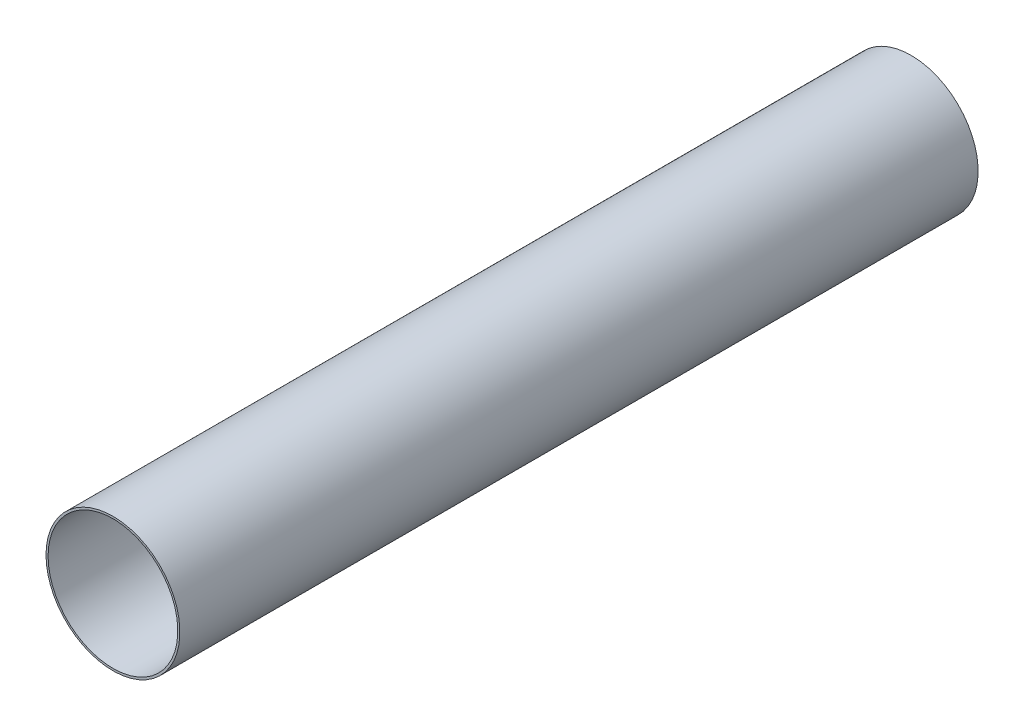
ISO-10303-21;
HEADER;
FILE_DESCRIPTION(('STEP AP214'),'2;1');
FILE_NAME('part.step','',(''),(''),'','','');
FILE_SCHEMA(('AUTOMOTIVE_DESIGN { 1 0 10303 214 1 1 1 1 }'));
ENDSEC;
DATA;
#1=APPLICATION_CONTEXT('core data for automotive mechanical design processes');
#2=APPLICATION_PROTOCOL_DEFINITION('international standard','automotive_design',2000,#1);
#3=PRODUCT_CONTEXT('',#1,'mechanical');
#4=PRODUCT('Part','Part','',(#3));
#5=PRODUCT_RELATED_PRODUCT_CATEGORY('part','',(#4));
#6=PRODUCT_DEFINITION_FORMATION('','',#4);
#7=PRODUCT_DEFINITION_CONTEXT('part definition',#1,'design');
#8=PRODUCT_DEFINITION('design','',#6,#7);
#9=PRODUCT_DEFINITION_SHAPE('','',#8);
#10=(LENGTH_UNIT() NAMED_UNIT(*) SI_UNIT(.MILLI.,.METRE.));
#11=(NAMED_UNIT(*) PLANE_ANGLE_UNIT() SI_UNIT($,.RADIAN.));
#12=(NAMED_UNIT(*) SI_UNIT($,.STERADIAN.) SOLID_ANGLE_UNIT());
#13=UNCERTAINTY_MEASURE_WITH_UNIT(LENGTH_MEASURE(1.E-05),#10,'distance_accuracy_value','');
#14=(GEOMETRIC_REPRESENTATION_CONTEXT(3) GLOBAL_UNCERTAINTY_ASSIGNED_CONTEXT((#13)) GLOBAL_UNIT_ASSIGNED_CONTEXT((#10,
#11,#12)) REPRESENTATION_CONTEXT('',''));
#15=CARTESIAN_POINT('',(0.,0.,0.));
#16=DIRECTION('',(0.,0.,1.));
#17=DIRECTION('',(1.,0.,0.));
#18=AXIS2_PLACEMENT_3D('',#15,#16,#17);
#19=CARTESIAN_POINT('',(0.,0.,609.6));
#20=DIRECTION('',(0.,0.,1.));
#21=DIRECTION('',(1.,0.,0.));
#22=AXIS2_PLACEMENT_3D('',#19,#20,#21);
#23=PLANE('',#22);
#24=CARTESIAN_POINT('',(0.,0.,609.6));
#25=DIRECTION('',(0.,0.,1.));
#26=DIRECTION('',(1.,0.,0.));
#27=AXIS2_PLACEMENT_3D('',#24,#25,#26);
#28=CIRCLE('',#27,51.1175);
#29=CARTESIAN_POINT('',(-51.1175,0.,609.6));
#30=VERTEX_POINT('',#29);
#31=EDGE_CURVE('E10',#30,#30,#28,.T.);
#32=ORIENTED_EDGE('',*,*,#31,.T.);
#33=EDGE_LOOP('',(#32));
#34=FACE_BOUND('',#33,.T.);
#35=CARTESIAN_POINT('',(0.,0.,609.6));
#36=DIRECTION('',(0.,0.,1.));
#37=DIRECTION('',(1.,0.,0.));
#38=AXIS2_PLACEMENT_3D('',#35,#36,#37);
#39=CIRCLE('',#38,49.53);
#40=CARTESIAN_POINT('',(-49.53,0.,609.6));
#41=VERTEX_POINT('',#40);
#42=EDGE_CURVE('E41',#41,#41,#39,.T.);
#43=ORIENTED_EDGE('',*,*,#42,.F.);
#44=EDGE_LOOP('',(#43));
#45=FACE_BOUND('',#44,.T.);
#46=ADVANCED_FACE('F30',(#34,#45),#23,.T.);
#47=CARTESIAN_POINT('',(0.,0.,0.));
#48=DIRECTION('',(0.,0.,1.));
#49=DIRECTION('',(1.,0.,0.));
#50=AXIS2_PLACEMENT_3D('',#47,#48,#49);
#51=PLANE('',#50);
#52=CARTESIAN_POINT('',(0.,0.,0.));
#53=DIRECTION('',(0.,0.,1.));
#54=DIRECTION('',(1.,0.,0.));
#55=AXIS2_PLACEMENT_3D('',#52,#53,#54);
#56=CIRCLE('',#55,51.1175);
#57=CARTESIAN_POINT('',(-51.1175,0.,0.));
#58=VERTEX_POINT('',#57);
#59=EDGE_CURVE('E34',#58,#58,#56,.T.);
#60=ORIENTED_EDGE('',*,*,#59,.F.);
#61=EDGE_LOOP('',(#60));
#62=FACE_BOUND('',#61,.T.);
#63=CARTESIAN_POINT('',(0.,0.,0.));
#64=DIRECTION('',(0.,0.,1.));
#65=DIRECTION('',(1.,0.,0.));
#66=AXIS2_PLACEMENT_3D('',#63,#64,#65);
#67=CIRCLE('',#66,49.53);
#68=CARTESIAN_POINT('',(-49.53,0.,0.));
#69=VERTEX_POINT('',#68);
#70=EDGE_CURVE('E43',#69,#69,#67,.T.);
#71=ORIENTED_EDGE('',*,*,#70,.T.);
#72=EDGE_LOOP('',(#71));
#73=FACE_BOUND('',#72,.T.);
#74=ADVANCED_FACE('F53',(#62,#73),#51,.F.);
#75=CARTESIAN_POINT('',(0.,0.,609.6));
#76=DIRECTION('',(0.,0.,-1.));
#77=DIRECTION('',(-1.,0.,0.));
#78=AXIS2_PLACEMENT_3D('',#75,#76,#77);
#79=CYLINDRICAL_SURFACE('',#78,51.1175);
#80=CARTESIAN_POINT('',(-51.1175,0.,609.6));
#81=CARTESIAN_POINT('',(-51.1175,0.,603.25));
#82=CARTESIAN_POINT('',(-51.1175,0.,596.9));
#83=CARTESIAN_POINT('',(-51.1175,0.,584.2));
#84=CARTESIAN_POINT('',(-51.1175,0.,577.85));
#85=CARTESIAN_POINT('',(-51.1175,0.,565.15));
#86=CARTESIAN_POINT('',(-51.1175,0.,558.8));
#87=CARTESIAN_POINT('',(-51.1175,0.,546.1));
#88=CARTESIAN_POINT('',(-51.1175,0.,539.75));
#89=CARTESIAN_POINT('',(-51.1175,0.,527.05));
#90=CARTESIAN_POINT('',(-51.1175,0.,520.7));
#91=CARTESIAN_POINT('',(-51.1175,0.,508.));
#92=CARTESIAN_POINT('',(-51.1175,0.,501.65));
#93=CARTESIAN_POINT('',(-51.1175,0.,488.95));
#94=CARTESIAN_POINT('',(-51.1175,0.,482.6));
#95=CARTESIAN_POINT('',(-51.1175,0.,469.9));
#96=CARTESIAN_POINT('',(-51.1175,0.,463.55));
#97=CARTESIAN_POINT('',(-51.1175,0.,450.85));
#98=CARTESIAN_POINT('',(-51.1175,0.,444.5));
#99=CARTESIAN_POINT('',(-51.1175,0.,431.8));
#100=CARTESIAN_POINT('',(-51.1175,0.,425.45));
#101=CARTESIAN_POINT('',(-51.1175,0.,412.75));
#102=CARTESIAN_POINT('',(-51.1175,0.,406.4));
#103=CARTESIAN_POINT('',(-51.1175,0.,393.7));
#104=CARTESIAN_POINT('',(-51.1175,0.,387.35));
#105=CARTESIAN_POINT('',(-51.1175,0.,374.65));
#106=CARTESIAN_POINT('',(-51.1175,0.,368.3));
#107=CARTESIAN_POINT('',(-51.1175,0.,355.6));
#108=CARTESIAN_POINT('',(-51.1175,0.,349.25));
#109=CARTESIAN_POINT('',(-51.1175,0.,336.55));
#110=CARTESIAN_POINT('',(-51.1175,0.,330.2));
#111=CARTESIAN_POINT('',(-51.1175,0.,317.5));
#112=CARTESIAN_POINT('',(-51.1175,0.,311.15));
#113=CARTESIAN_POINT('',(-51.1175,0.,298.45));
#114=CARTESIAN_POINT('',(-51.1175,0.,292.1));
#115=CARTESIAN_POINT('',(-51.1175,0.,279.4));
#116=CARTESIAN_POINT('',(-51.1175,0.,273.05));
#117=CARTESIAN_POINT('',(-51.1175,0.,260.35));
#118=CARTESIAN_POINT('',(-51.1175,0.,254.));
#119=CARTESIAN_POINT('',(-51.1175,0.,241.3));
#120=CARTESIAN_POINT('',(-51.1175,0.,234.95));
#121=CARTESIAN_POINT('',(-51.1175,0.,222.25));
#122=CARTESIAN_POINT('',(-51.1175,0.,215.9));
#123=CARTESIAN_POINT('',(-51.1175,0.,203.2));
#124=CARTESIAN_POINT('',(-51.1175,0.,196.85));
#125=CARTESIAN_POINT('',(-51.1175,0.,184.15));
#126=CARTESIAN_POINT('',(-51.1175,0.,177.8));
#127=CARTESIAN_POINT('',(-51.1175,0.,165.1));
#128=CARTESIAN_POINT('',(-51.1175,0.,158.75));
#129=CARTESIAN_POINT('',(-51.1175,0.,146.05));
#130=CARTESIAN_POINT('',(-51.1175,0.,139.7));
#131=CARTESIAN_POINT('',(-51.1175,0.,127.));
#132=CARTESIAN_POINT('',(-51.1175,0.,120.65));
#133=CARTESIAN_POINT('',(-51.1175,0.,107.95));
#134=CARTESIAN_POINT('',(-51.1175,0.,101.6));
#135=CARTESIAN_POINT('',(-51.1175,0.,88.9));
#136=CARTESIAN_POINT('',(-51.1175,0.,82.5500000000001));
#137=CARTESIAN_POINT('',(-51.1175,0.,69.85));
#138=CARTESIAN_POINT('',(-51.1175,0.,63.5));
#139=CARTESIAN_POINT('',(-51.1175,0.,50.8));
#140=CARTESIAN_POINT('',(-51.1175,0.,44.45));
#141=CARTESIAN_POINT('',(-51.1175,0.,31.75));
#142=CARTESIAN_POINT('',(-51.1175,0.,25.4));
#143=CARTESIAN_POINT('',(-51.1175,0.,12.7));
#144=CARTESIAN_POINT('',(-51.1175,0.,6.35000000000001));
#145=CARTESIAN_POINT('',(-51.1175,0.,0.));
#146=B_SPLINE_CURVE_WITH_KNOTS('',3,(#80,#81,#82,#83,#84,#85,#86,#87,#88,#89,#90,#91,#92,#93,
#94,#95,#96,#97,#98,#99,#100,#101,#102,#103,#104,#105,#106,#107,#108,#109,#110,#111,#112,#113,
#114,#115,#116,#117,#118,#119,#120,#121,#122,#123,#124,#125,#126,#127,#128,#129,#130,#131,#132,
#133,#134,#135,#136,#137,#138,#139,#140,#141,#142,#143,#144,#145),.UNSPECIFIED.,.F.,.F.,(4,2,2,
2,2,2,2,2,2,2,2,2,2,2,2,2,2,2,2,2,2,2,2,2,2,2,2,2,2,2,2,2,4),(0.,19.05,38.1,57.15,76.2,
95.2500000000001,114.3,133.35,152.4,171.45,190.5,209.55,228.6,247.65,266.7,285.75,304.8,323.85,
342.9,361.95,381.,400.05,419.1,438.15,457.2,476.25,495.3,514.35,533.4,552.45,571.5,590.55,
609.6),.UNSPECIFIED.);
#147=EDGE_CURVE('BSEAM32',#30,#58,#146,.T.);
#148=ORIENTED_EDGE('',*,*,#31,.F.);
#149=ORIENTED_EDGE('',*,*,#59,.T.);
#150=ORIENTED_EDGE('',*,*,#147,.T.);
#151=ORIENTED_EDGE('',*,*,#147,.F.);
#152=EDGE_LOOP('',(#148,#150,#149,#151));
#153=FACE_BOUND('',#152,.T.);
#154=ADVANCED_FACE('F32',(#153),#79,.T.);
#155=CARTESIAN_POINT('',(0.,0.,609.6));
#156=DIRECTION('',(0.,0.,-1.));
#157=DIRECTION('',(-1.,0.,0.));
#158=AXIS2_PLACEMENT_3D('',#155,#156,#157);
#159=CYLINDRICAL_SURFACE('',#158,49.53);
#160=CARTESIAN_POINT('',(-49.53,0.,609.6));
#161=CARTESIAN_POINT('',(-49.53,0.,603.25));
#162=CARTESIAN_POINT('',(-49.53,0.,596.9));
#163=CARTESIAN_POINT('',(-49.53,0.,584.2));
#164=CARTESIAN_POINT('',(-49.53,0.,577.85));
#165=CARTESIAN_POINT('',(-49.53,0.,565.15));
#166=CARTESIAN_POINT('',(-49.53,0.,558.8));
#167=CARTESIAN_POINT('',(-49.53,0.,546.1));
#168=CARTESIAN_POINT('',(-49.53,0.,539.75));
#169=CARTESIAN_POINT('',(-49.53,0.,527.05));
#170=CARTESIAN_POINT('',(-49.53,0.,520.7));
#171=CARTESIAN_POINT('',(-49.53,0.,508.));
#172=CARTESIAN_POINT('',(-49.53,0.,501.65));
#173=CARTESIAN_POINT('',(-49.53,0.,488.95));
#174=CARTESIAN_POINT('',(-49.53,0.,482.6));
#175=CARTESIAN_POINT('',(-49.53,0.,469.9));
#176=CARTESIAN_POINT('',(-49.53,0.,463.55));
#177=CARTESIAN_POINT('',(-49.53,0.,450.85));
#178=CARTESIAN_POINT('',(-49.53,0.,444.5));
#179=CARTESIAN_POINT('',(-49.53,0.,431.8));
#180=CARTESIAN_POINT('',(-49.53,0.,425.45));
#181=CARTESIAN_POINT('',(-49.53,0.,412.75));
#182=CARTESIAN_POINT('',(-49.53,0.,406.4));
#183=CARTESIAN_POINT('',(-49.53,0.,393.7));
#184=CARTESIAN_POINT('',(-49.53,0.,387.35));
#185=CARTESIAN_POINT('',(-49.53,0.,374.65));
#186=CARTESIAN_POINT('',(-49.53,0.,368.3));
#187=CARTESIAN_POINT('',(-49.53,0.,355.6));
#188=CARTESIAN_POINT('',(-49.53,0.,349.25));
#189=CARTESIAN_POINT('',(-49.53,0.,336.55));
#190=CARTESIAN_POINT('',(-49.53,0.,330.2));
#191=CARTESIAN_POINT('',(-49.53,0.,317.5));
#192=CARTESIAN_POINT('',(-49.53,0.,311.15));
#193=CARTESIAN_POINT('',(-49.53,0.,298.45));
#194=CARTESIAN_POINT('',(-49.53,0.,292.1));
#195=CARTESIAN_POINT('',(-49.53,0.,279.4));
#196=CARTESIAN_POINT('',(-49.53,0.,273.05));
#197=CARTESIAN_POINT('',(-49.53,0.,260.35));
#198=CARTESIAN_POINT('',(-49.53,0.,254.));
#199=CARTESIAN_POINT('',(-49.53,0.,241.3));
#200=CARTESIAN_POINT('',(-49.53,0.,234.95));
#201=CARTESIAN_POINT('',(-49.53,0.,222.25));
#202=CARTESIAN_POINT('',(-49.53,0.,215.9));
#203=CARTESIAN_POINT('',(-49.53,0.,203.2));
#204=CARTESIAN_POINT('',(-49.53,0.,196.85));
#205=CARTESIAN_POINT('',(-49.53,0.,184.15));
#206=CARTESIAN_POINT('',(-49.53,0.,177.8));
#207=CARTESIAN_POINT('',(-49.53,0.,165.1));
#208=CARTESIAN_POINT('',(-49.53,0.,158.75));
#209=CARTESIAN_POINT('',(-49.53,0.,146.05));
#210=CARTESIAN_POINT('',(-49.53,0.,139.7));
#211=CARTESIAN_POINT('',(-49.53,0.,127.));
#212=CARTESIAN_POINT('',(-49.53,0.,120.65));
#213=CARTESIAN_POINT('',(-49.53,0.,107.95));
#214=CARTESIAN_POINT('',(-49.53,0.,101.6));
#215=CARTESIAN_POINT('',(-49.53,0.,88.9));
#216=CARTESIAN_POINT('',(-49.53,0.,82.5500000000001));
#217=CARTESIAN_POINT('',(-49.53,0.,69.85));
#218=CARTESIAN_POINT('',(-49.53,0.,63.5));
#219=CARTESIAN_POINT('',(-49.53,0.,50.8));
#220=CARTESIAN_POINT('',(-49.53,0.,44.45));
#221=CARTESIAN_POINT('',(-49.53,0.,31.75));
#222=CARTESIAN_POINT('',(-49.53,0.,25.4));
#223=CARTESIAN_POINT('',(-49.53,0.,12.7));
#224=CARTESIAN_POINT('',(-49.53,0.,6.35000000000001));
#225=CARTESIAN_POINT('',(-49.53,0.,0.));
#226=B_SPLINE_CURVE_WITH_KNOTS('',3,(#160,#161,#162,#163,#164,#165,#166,#167,#168,#169,#170,
#171,#172,#173,#174,#175,#176,#177,#178,#179,#180,#181,#182,#183,#184,#185,#186,#187,#188,#189,
#190,#191,#192,#193,#194,#195,#196,#197,#198,#199,#200,#201,#202,#203,#204,#205,#206,#207,#208,
#209,#210,#211,#212,#213,#214,#215,#216,#217,#218,#219,#220,#221,#222,#223,#224,#225),
.UNSPECIFIED.,.F.,.F.,(4,2,2,2,2,2,2,2,2,2,2,2,2,2,2,2,2,2,2,2,2,2,2,2,2,2,2,2,2,2,2,2,4),(0.,
19.05,38.1,57.15,76.2,95.2500000000001,114.3,133.35,152.4,171.45,190.5,209.55,228.6,247.65,
266.7,285.75,304.8,323.85,342.9,361.95,381.,400.05,419.1,438.15,457.2,476.25,495.3,514.35,533.4,
552.45,571.5,590.55,609.6),.UNSPECIFIED.);
#227=EDGE_CURVE('BSEAM49',#41,#69,#226,.T.);
#228=ORIENTED_EDGE('',*,*,#42,.T.);
#229=ORIENTED_EDGE('',*,*,#70,.F.);
#230=ORIENTED_EDGE('',*,*,#227,.T.);
#231=ORIENTED_EDGE('',*,*,#227,.F.);
#232=EDGE_LOOP('',(#228,#230,#229,#231));
#233=FACE_BOUND('',#232,.T.);
#234=ADVANCED_FACE('F49',(#233),#159,.F.);
#235=CLOSED_SHELL('',(#46,#74,#154,#234));
#236=MANIFOLD_SOLID_BREP('B2',#235);
#237=ADVANCED_BREP_SHAPE_REPRESENTATION('',(#18,#236),#14);
#238=SHAPE_DEFINITION_REPRESENTATION(#9,#237);
ENDSEC;
END-ISO-10303-21;
